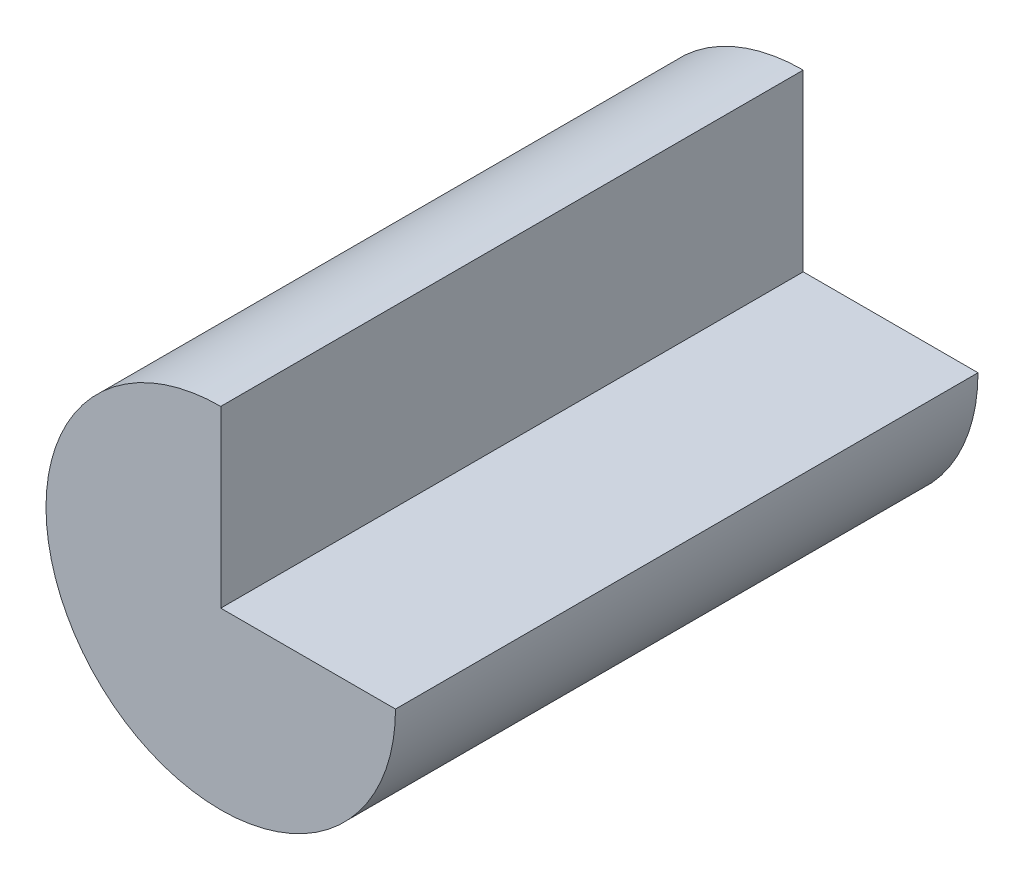
ISO-10303-21;
HEADER;
FILE_DESCRIPTION(('STEP AP214'),'2;1');
FILE_NAME('part.step','',(''),(''),'','','');
FILE_SCHEMA(('AUTOMOTIVE_DESIGN { 1 0 10303 214 1 1 1 1 }'));
ENDSEC;
DATA;
#1=APPLICATION_CONTEXT('core data for automotive mechanical design processes');
#2=APPLICATION_PROTOCOL_DEFINITION('international standard','automotive_design',2000,#1);
#3=PRODUCT_CONTEXT('',#1,'mechanical');
#4=PRODUCT('Part','Part','',(#3));
#5=PRODUCT_RELATED_PRODUCT_CATEGORY('part','',(#4));
#6=PRODUCT_DEFINITION_FORMATION('','',#4);
#7=PRODUCT_DEFINITION_CONTEXT('part definition',#1,'design');
#8=PRODUCT_DEFINITION('design','',#6,#7);
#9=PRODUCT_DEFINITION_SHAPE('','',#8);
#10=(LENGTH_UNIT() NAMED_UNIT(*) SI_UNIT(.MILLI.,.METRE.));
#11=(NAMED_UNIT(*) PLANE_ANGLE_UNIT() SI_UNIT($,.RADIAN.));
#12=(NAMED_UNIT(*) SI_UNIT($,.STERADIAN.) SOLID_ANGLE_UNIT());
#13=UNCERTAINTY_MEASURE_WITH_UNIT(LENGTH_MEASURE(1.E-05),#10,'distance_accuracy_value','');
#14=(GEOMETRIC_REPRESENTATION_CONTEXT(3) GLOBAL_UNCERTAINTY_ASSIGNED_CONTEXT((#13)) GLOBAL_UNIT_ASSIGNED_CONTEXT((#10,
#11,#12)) REPRESENTATION_CONTEXT('',''));
#15=CARTESIAN_POINT('',(0.,0.,0.));
#16=DIRECTION('',(0.,0.,1.));
#17=DIRECTION('',(1.,0.,0.));
#18=AXIS2_PLACEMENT_3D('',#15,#16,#17);
#19=CARTESIAN_POINT('',(0.,0.,-500.));
#20=DIRECTION('',(0.,0.,1.));
#21=DIRECTION('',(1.,0.,0.));
#22=AXIS2_PLACEMENT_3D('',#19,#20,#21);
#23=CYLINDRICAL_SURFACE('',#22,150.);
#24=CARTESIAN_POINT('',(0.,0.,0.));
#25=DIRECTION('',(0.,0.,1.));
#26=DIRECTION('',(1.,0.,0.));
#27=AXIS2_PLACEMENT_3D('',#24,#25,#26);
#28=CIRCLE('',#27,150.);
#29=CARTESIAN_POINT('',(0.,150.,0.));
#30=VERTEX_POINT('',#29);
#31=CARTESIAN_POINT('',(150.,0.,0.));
#32=VERTEX_POINT('',#31);
#33=EDGE_CURVE('E38',#30,#32,#28,.T.);
#34=ORIENTED_EDGE('',*,*,#33,.F.);
#35=DIRECTION('',(0.,0.,1.));
#36=VECTOR('',#35,1.);
#37=CARTESIAN_POINT('',(0.,150.,-500.));
#38=LINE('',#37,#36);
#39=CARTESIAN_POINT('',(0.,150.,-500.));
#40=VERTEX_POINT('',#39);
#41=EDGE_CURVE('E65',#40,#30,#38,.T.);
#42=ORIENTED_EDGE('',*,*,#41,.F.);
#43=CARTESIAN_POINT('',(0.,0.,-500.));
#44=DIRECTION('',(0.,0.,1.));
#45=DIRECTION('',(1.,0.,0.));
#46=AXIS2_PLACEMENT_3D('',#43,#44,#45);
#47=CIRCLE('',#46,150.);
#48=CARTESIAN_POINT('',(150.,0.,-500.));
#49=VERTEX_POINT('',#48);
#50=EDGE_CURVE('E11',#40,#49,#47,.T.);
#51=ORIENTED_EDGE('',*,*,#50,.T.);
#52=DIRECTION('',(0.,0.,1.));
#53=VECTOR('',#52,1.);
#54=CARTESIAN_POINT('',(150.,0.,-500.));
#55=LINE('',#54,#53);
#56=EDGE_CURVE('E71',#49,#32,#55,.T.);
#57=ORIENTED_EDGE('',*,*,#56,.T.);
#58=EDGE_LOOP('',(#34,#42,#51,#57));
#59=FACE_BOUND('',#58,.T.);
#60=ADVANCED_FACE('F35',(#59),#23,.T.);
#61=CARTESIAN_POINT('',(0.,0.,-500.));
#62=DIRECTION('',(0.,0.,1.));
#63=DIRECTION('',(1.,0.,0.));
#64=AXIS2_PLACEMENT_3D('',#61,#62,#63);
#65=PLANE('',#64);
#66=ORIENTED_EDGE('',*,*,#50,.F.);
#67=DIRECTION('',(0.,-1.,0.));
#68=VECTOR('',#67,1.);
#69=CARTESIAN_POINT('',(0.,0.,-500.));
#70=LINE('',#69,#68);
#71=CARTESIAN_POINT('',(0.,0.,-500.));
#72=VERTEX_POINT('',#71);
#73=EDGE_CURVE('E55',#40,#72,#70,.T.);
#74=ORIENTED_EDGE('',*,*,#73,.T.);
#75=DIRECTION('',(1.,0.,0.));
#76=VECTOR('',#75,1.);
#77=CARTESIAN_POINT('',(0.,0.,-500.));
#78=LINE('',#77,#76);
#79=EDGE_CURVE('E72',#72,#49,#78,.T.);
#80=ORIENTED_EDGE('',*,*,#79,.T.);
#81=EDGE_LOOP('',(#66,#74,#80));
#82=FACE_BOUND('',#81,.T.);
#83=ADVANCED_FACE('F80',(#82),#65,.F.);
#84=CARTESIAN_POINT('',(0.,0.,0.));
#85=DIRECTION('',(0.,0.,1.));
#86=DIRECTION('',(1.,0.,0.));
#87=AXIS2_PLACEMENT_3D('',#84,#85,#86);
#88=PLANE('',#87);
#89=DIRECTION('',(0.,-1.,0.));
#90=VECTOR('',#89,1.);
#91=CARTESIAN_POINT('',(0.,0.,0.));
#92=LINE('',#91,#90);
#93=CARTESIAN_POINT('',(0.,0.,0.));
#94=VERTEX_POINT('',#93);
#95=EDGE_CURVE('E49',#30,#94,#92,.T.);
#96=ORIENTED_EDGE('',*,*,#95,.F.);
#97=ORIENTED_EDGE('',*,*,#33,.T.);
#98=DIRECTION('',(1.,0.,0.));
#99=VECTOR('',#98,1.);
#100=CARTESIAN_POINT('',(0.,0.,0.));
#101=LINE('',#100,#99);
#102=EDGE_CURVE('E81',#94,#32,#101,.T.);
#103=ORIENTED_EDGE('',*,*,#102,.F.);
#104=EDGE_LOOP('',(#96,#97,#103));
#105=FACE_BOUND('',#104,.T.);
#106=ADVANCED_FACE('F91',(#105),#88,.T.);
#107=CARTESIAN_POINT('',(0.,0.,-500.));
#108=DIRECTION('',(-1.,0.,0.));
#109=DIRECTION('',(0.,0.,1.));
#110=AXIS2_PLACEMENT_3D('',#107,#108,#109);
#111=PLANE('',#110);
#112=ORIENTED_EDGE('',*,*,#95,.T.);
#113=DIRECTION('',(0.,0.,1.));
#114=VECTOR('',#113,1.);
#115=CARTESIAN_POINT('',(0.,0.,-500.));
#116=LINE('',#115,#114);
#117=EDGE_CURVE('E66',#72,#94,#116,.T.);
#118=ORIENTED_EDGE('',*,*,#117,.F.);
#119=ORIENTED_EDGE('',*,*,#73,.F.);
#120=ORIENTED_EDGE('',*,*,#41,.T.);
#121=EDGE_LOOP('',(#112,#118,#119,#120));
#122=FACE_BOUND('',#121,.T.);
#123=ADVANCED_FACE('F68',(#122),#111,.F.);
#124=CARTESIAN_POINT('',(0.,0.,-500.));
#125=DIRECTION('',(0.,-1.,0.));
#126=DIRECTION('',(0.,0.,-1.));
#127=AXIS2_PLACEMENT_3D('',#124,#125,#126);
#128=PLANE('',#127);
#129=ORIENTED_EDGE('',*,*,#102,.T.);
#130=ORIENTED_EDGE('',*,*,#56,.F.);
#131=ORIENTED_EDGE('',*,*,#79,.F.);
#132=ORIENTED_EDGE('',*,*,#117,.T.);
#133=EDGE_LOOP('',(#129,#130,#131,#132));
#134=FACE_BOUND('',#133,.T.);
#135=ADVANCED_FACE('F75',(#134),#128,.F.);
#136=CLOSED_SHELL('',(#60,#83,#106,#123,#135));
#137=MANIFOLD_SOLID_BREP('B2',#136);
#138=ADVANCED_BREP_SHAPE_REPRESENTATION('',(#18,#137),#14);
#139=SHAPE_DEFINITION_REPRESENTATION(#9,#138);
ENDSEC;
END-ISO-10303-21;
